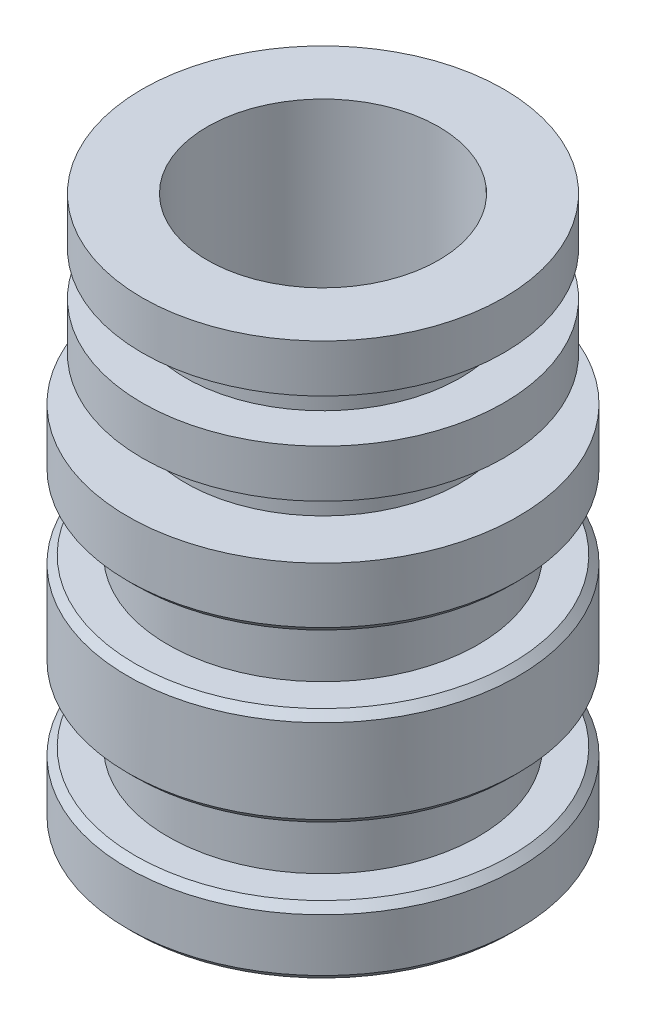
ISO-10303-21;
HEADER;
FILE_DESCRIPTION(('STEP AP214'),'2;1');
FILE_NAME('part.step','',(''),(''),'','','');
FILE_SCHEMA(('AUTOMOTIVE_DESIGN { 1 0 10303 214 1 1 1 1 }'));
ENDSEC;
DATA;
#1=APPLICATION_CONTEXT('core data for automotive mechanical design processes');
#2=APPLICATION_PROTOCOL_DEFINITION('international standard','automotive_design',2000,#1);
#3=PRODUCT_CONTEXT('',#1,'mechanical');
#4=PRODUCT('Part','Part','',(#3));
#5=PRODUCT_RELATED_PRODUCT_CATEGORY('part','',(#4));
#6=PRODUCT_DEFINITION_FORMATION('','',#4);
#7=PRODUCT_DEFINITION_CONTEXT('part definition',#1,'design');
#8=PRODUCT_DEFINITION('design','',#6,#7);
#9=PRODUCT_DEFINITION_SHAPE('','',#8);
#10=(LENGTH_UNIT() NAMED_UNIT(*) SI_UNIT(.MILLI.,.METRE.));
#11=(NAMED_UNIT(*) PLANE_ANGLE_UNIT() SI_UNIT($,.RADIAN.));
#12=(NAMED_UNIT(*) SI_UNIT($,.STERADIAN.) SOLID_ANGLE_UNIT());
#13=UNCERTAINTY_MEASURE_WITH_UNIT(LENGTH_MEASURE(1.E-05),#10,'distance_accuracy_value','');
#14=(GEOMETRIC_REPRESENTATION_CONTEXT(3) GLOBAL_UNCERTAINTY_ASSIGNED_CONTEXT((#13)) GLOBAL_UNIT_ASSIGNED_CONTEXT((#10,
#11,#12)) REPRESENTATION_CONTEXT('',''));
#15=CARTESIAN_POINT('',(0.,0.,0.));
#16=DIRECTION('',(0.,0.,1.));
#17=DIRECTION('',(1.,0.,0.));
#18=AXIS2_PLACEMENT_3D('',#15,#16,#17);
#19=CARTESIAN_POINT('',(-12.5,37.8,0.));
#20=DIRECTION('',(0.,-1.,0.));
#21=DIRECTION('',(0.,0.,-1.));
#22=AXIS2_PLACEMENT_3D('',#19,#20,#21);
#23=PLANE('',#22);
#24=CARTESIAN_POINT('',(0.,37.8,0.));
#25=DIRECTION('',(0.,-1.,0.));
#26=DIRECTION('',(0.,0.,-1.));
#27=AXIS2_PLACEMENT_3D('',#24,#25,#26);
#28=CIRCLE('',#27,12.5);
#29=CARTESIAN_POINT('',(0.,37.8,-12.5));
#30=VERTEX_POINT('',#29);
#31=EDGE_CURVE('E92',#30,#30,#28,.T.);
#32=ORIENTED_EDGE('',*,*,#31,.F.);
#33=EDGE_LOOP('',(#32));
#34=FACE_BOUND('',#33,.T.);
#35=CARTESIAN_POINT('',(0.,37.8,0.));
#36=DIRECTION('',(0.,-1.,0.));
#37=DIRECTION('',(0.,0.,-1.));
#38=AXIS2_PLACEMENT_3D('',#35,#36,#37);
#39=CIRCLE('',#38,8.);
#40=CARTESIAN_POINT('',(0.,37.8,-8.));
#41=VERTEX_POINT('',#40);
#42=EDGE_CURVE('E89',#41,#41,#39,.T.);
#43=ORIENTED_EDGE('',*,*,#42,.T.);
#44=EDGE_LOOP('',(#43));
#45=FACE_BOUND('',#44,.T.);
#46=ADVANCED_FACE('F38',(#34,#45),#23,.F.);
#47=CARTESIAN_POINT('',(0.,-29.1154086371947,0.));
#48=DIRECTION('',(0.,-1.,0.));
#49=DIRECTION('',(0.,0.,-1.));
#50=AXIS2_PLACEMENT_3D('',#47,#48,#49);
#51=CYLINDRICAL_SURFACE('',#50,12.5);
#52=CARTESIAN_POINT('',(0.,34.5,0.));
#53=DIRECTION('',(0.,-1.,0.));
#54=DIRECTION('',(0.,0.,-1.));
#55=AXIS2_PLACEMENT_3D('',#52,#53,#54);
#56=CIRCLE('',#55,12.5);
#57=CARTESIAN_POINT('',(0.,34.5,-12.5));
#58=VERTEX_POINT('',#57);
#59=EDGE_CURVE('E95',#58,#58,#56,.T.);
#60=ORIENTED_EDGE('',*,*,#59,.F.);
#61=EDGE_LOOP('',(#60));
#62=FACE_BOUND('',#61,.T.);
#63=ORIENTED_EDGE('',*,*,#31,.T.);
#64=EDGE_LOOP('',(#63));
#65=FACE_BOUND('',#64,.T.);
#66=ADVANCED_FACE('F152',(#62,#65),#51,.T.);
#67=CARTESIAN_POINT('',(-9.50000000000001,34.5,0.));
#68=DIRECTION('',(0.,1.,0.));
#69=DIRECTION('',(0.,0.,1.));
#70=AXIS2_PLACEMENT_3D('',#67,#68,#69);
#71=PLANE('',#70);
#72=CARTESIAN_POINT('',(0.,34.5,0.));
#73=DIRECTION('',(0.,-1.,0.));
#74=DIRECTION('',(0.,0.,-1.));
#75=AXIS2_PLACEMENT_3D('',#72,#73,#74);
#76=CIRCLE('',#75,9.50000000000001);
#77=CARTESIAN_POINT('',(0.,34.5,-9.50000000000001));
#78=VERTEX_POINT('',#77);
#79=EDGE_CURVE('E98',#78,#78,#76,.T.);
#80=ORIENTED_EDGE('',*,*,#79,.F.);
#81=EDGE_LOOP('',(#80));
#82=FACE_BOUND('',#81,.T.);
#83=ORIENTED_EDGE('',*,*,#59,.T.);
#84=EDGE_LOOP('',(#83));
#85=FACE_BOUND('',#84,.T.);
#86=ADVANCED_FACE('F158',(#82,#85),#71,.F.);
#87=CARTESIAN_POINT('',(0.,-29.1154086371947,0.));
#88=DIRECTION('',(0.,-1.,0.));
#89=DIRECTION('',(0.,0.,-1.));
#90=AXIS2_PLACEMENT_3D('',#87,#88,#89);
#91=CYLINDRICAL_SURFACE('',#90,9.50000000000001);
#92=CARTESIAN_POINT('',(0.,31.5,0.));
#93=DIRECTION('',(0.,-1.,0.));
#94=DIRECTION('',(0.,0.,-1.));
#95=AXIS2_PLACEMENT_3D('',#92,#93,#94);
#96=CIRCLE('',#95,9.50000000000001);
#97=CARTESIAN_POINT('',(0.,31.5,-9.50000000000001));
#98=VERTEX_POINT('',#97);
#99=EDGE_CURVE('E101',#98,#98,#96,.T.);
#100=ORIENTED_EDGE('',*,*,#99,.F.);
#101=EDGE_LOOP('',(#100));
#102=FACE_BOUND('',#101,.T.);
#103=ORIENTED_EDGE('',*,*,#79,.T.);
#104=EDGE_LOOP('',(#103));
#105=FACE_BOUND('',#104,.T.);
#106=ADVANCED_FACE('F270',(#102,#105),#91,.T.);
#107=CARTESIAN_POINT('',(-12.5,31.5,0.));
#108=DIRECTION('',(0.,-1.,0.));
#109=DIRECTION('',(0.,0.,-1.));
#110=AXIS2_PLACEMENT_3D('',#107,#108,#109);
#111=PLANE('',#110);
#112=CARTESIAN_POINT('',(0.,31.5,0.));
#113=DIRECTION('',(0.,-1.,0.));
#114=DIRECTION('',(0.,0.,-1.));
#115=AXIS2_PLACEMENT_3D('',#112,#113,#114);
#116=CIRCLE('',#115,12.5);
#117=CARTESIAN_POINT('',(0.,31.5,-12.5));
#118=VERTEX_POINT('',#117);
#119=EDGE_CURVE('E104',#118,#118,#116,.T.);
#120=ORIENTED_EDGE('',*,*,#119,.F.);
#121=EDGE_LOOP('',(#120));
#122=FACE_BOUND('',#121,.T.);
#123=ORIENTED_EDGE('',*,*,#99,.T.);
#124=EDGE_LOOP('',(#123));
#125=FACE_BOUND('',#124,.T.);
#126=ADVANCED_FACE('F266',(#122,#125),#111,.F.);
#127=CARTESIAN_POINT('',(0.,-29.1154086371947,0.));
#128=DIRECTION('',(0.,-1.,0.));
#129=DIRECTION('',(0.,0.,-1.));
#130=AXIS2_PLACEMENT_3D('',#127,#128,#129);
#131=CYLINDRICAL_SURFACE('',#130,12.5);
#132=CARTESIAN_POINT('',(0.,28.2,0.));
#133=DIRECTION('',(0.,-1.,0.));
#134=DIRECTION('',(0.,0.,-1.));
#135=AXIS2_PLACEMENT_3D('',#132,#133,#134);
#136=CIRCLE('',#135,12.5);
#137=CARTESIAN_POINT('',(0.,28.2,-12.5));
#138=VERTEX_POINT('',#137);
#139=EDGE_CURVE('E107',#138,#138,#136,.T.);
#140=ORIENTED_EDGE('',*,*,#139,.F.);
#141=EDGE_LOOP('',(#140));
#142=FACE_BOUND('',#141,.T.);
#143=ORIENTED_EDGE('',*,*,#119,.T.);
#144=EDGE_LOOP('',(#143));
#145=FACE_BOUND('',#144,.T.);
#146=ADVANCED_FACE('F262',(#142,#145),#131,.T.);
#147=CARTESIAN_POINT('',(-12.5,28.2,0.));
#148=DIRECTION('',(0.,1.,0.));
#149=DIRECTION('',(0.,0.,1.));
#150=AXIS2_PLACEMENT_3D('',#147,#148,#149);
#151=PLANE('',#150);
#152=CARTESIAN_POINT('',(0.,28.2,0.));
#153=DIRECTION('',(0.,-1.,0.));
#154=DIRECTION('',(0.,0.,-1.));
#155=AXIS2_PLACEMENT_3D('',#152,#153,#154);
#156=CIRCLE('',#155,9.50000000000001);
#157=CARTESIAN_POINT('',(0.,28.2,-9.50000000000001));
#158=VERTEX_POINT('',#157);
#159=EDGE_CURVE('E110',#158,#158,#156,.T.);
#160=ORIENTED_EDGE('',*,*,#159,.F.);
#161=EDGE_LOOP('',(#160));
#162=FACE_BOUND('',#161,.T.);
#163=ORIENTED_EDGE('',*,*,#139,.T.);
#164=EDGE_LOOP('',(#163));
#165=FACE_BOUND('',#164,.T.);
#166=ADVANCED_FACE('F258',(#162,#165),#151,.F.);
#167=CARTESIAN_POINT('',(0.,-29.1154086371947,0.));
#168=DIRECTION('',(0.,-1.,0.));
#169=DIRECTION('',(0.,0.,-1.));
#170=AXIS2_PLACEMENT_3D('',#167,#168,#169);
#171=CYLINDRICAL_SURFACE('',#170,9.50000000000001);
#172=CARTESIAN_POINT('',(0.,25.2,0.));
#173=DIRECTION('',(0.,-1.,0.));
#174=DIRECTION('',(0.,0.,-1.));
#175=AXIS2_PLACEMENT_3D('',#172,#173,#174);
#176=CIRCLE('',#175,9.50000000000001);
#177=CARTESIAN_POINT('',(0.,25.2,-9.50000000000001));
#178=VERTEX_POINT('',#177);
#179=EDGE_CURVE('E113',#178,#178,#176,.T.);
#180=ORIENTED_EDGE('',*,*,#179,.F.);
#181=EDGE_LOOP('',(#180));
#182=FACE_BOUND('',#181,.T.);
#183=ORIENTED_EDGE('',*,*,#159,.T.);
#184=EDGE_LOOP('',(#183));
#185=FACE_BOUND('',#184,.T.);
#186=ADVANCED_FACE('F254',(#182,#185),#171,.T.);
#187=CARTESIAN_POINT('',(-13.5,25.2,0.));
#188=DIRECTION('',(0.,-1.,0.));
#189=DIRECTION('',(0.,0.,-1.));
#190=AXIS2_PLACEMENT_3D('',#187,#188,#189);
#191=PLANE('',#190);
#192=CARTESIAN_POINT('',(0.,25.2,0.));
#193=DIRECTION('',(0.,-1.,0.));
#194=DIRECTION('',(0.,0.,-1.));
#195=AXIS2_PLACEMENT_3D('',#192,#193,#194);
#196=CIRCLE('',#195,13.5);
#197=CARTESIAN_POINT('',(0.,25.2,-13.5));
#198=VERTEX_POINT('',#197);
#199=EDGE_CURVE('E116',#198,#198,#196,.T.);
#200=ORIENTED_EDGE('',*,*,#199,.F.);
#201=EDGE_LOOP('',(#200));
#202=FACE_BOUND('',#201,.T.);
#203=ORIENTED_EDGE('',*,*,#179,.T.);
#204=EDGE_LOOP('',(#203));
#205=FACE_BOUND('',#204,.T.);
#206=ADVANCED_FACE('F250',(#202,#205),#191,.F.);
#207=CARTESIAN_POINT('',(0.,-29.1154086371947,0.));
#208=DIRECTION('',(0.,-1.,0.));
#209=DIRECTION('',(0.,0.,-1.));
#210=AXIS2_PLACEMENT_3D('',#207,#208,#209);
#211=CYLINDRICAL_SURFACE('',#210,13.5);
#212=CARTESIAN_POINT('',(0.,21.34,0.));
#213=DIRECTION('',(0.,1.,0.));
#214=DIRECTION('',(0.,0.,1.));
#215=AXIS2_PLACEMENT_3D('',#212,#213,#214);
#216=CIRCLE('',#215,13.5);
#217=CARTESIAN_POINT('',(0.,21.34,13.5));
#218=VERTEX_POINT('',#217);
#219=EDGE_CURVE('E71',#218,#218,#216,.T.);
#220=ORIENTED_EDGE('',*,*,#219,.T.);
#221=EDGE_LOOP('',(#220));
#222=FACE_BOUND('',#221,.T.);
#223=ORIENTED_EDGE('',*,*,#199,.T.);
#224=EDGE_LOOP('',(#223));
#225=FACE_BOUND('',#224,.T.);
#226=ADVANCED_FACE('F246',(#222,#225),#211,.T.);
#227=CARTESIAN_POINT('',(-13.5,20.84,0.));
#228=DIRECTION('',(0.,1.,0.));
#229=DIRECTION('',(0.,0.,1.));
#230=AXIS2_PLACEMENT_3D('',#227,#228,#229);
#231=PLANE('',#230);
#232=CARTESIAN_POINT('',(0.,20.84,0.));
#233=DIRECTION('',(0.,1.,0.));
#234=DIRECTION('',(0.,0.,1.));
#235=AXIS2_PLACEMENT_3D('',#232,#233,#234);
#236=CIRCLE('',#235,13.);
#237=CARTESIAN_POINT('',(0.,20.84,13.));
#238=VERTEX_POINT('',#237);
#239=EDGE_CURVE('E74',#238,#238,#236,.F.);
#240=ORIENTED_EDGE('',*,*,#239,.T.);
#241=EDGE_LOOP('',(#240));
#242=FACE_BOUND('',#241,.T.);
#243=CARTESIAN_POINT('',(0.,20.84,0.));
#244=DIRECTION('',(0.,-1.,0.));
#245=DIRECTION('',(0.,0.,-1.));
#246=AXIS2_PLACEMENT_3D('',#243,#244,#245);
#247=CIRCLE('',#246,10.73);
#248=CARTESIAN_POINT('',(0.,20.84,-10.73));
#249=VERTEX_POINT('',#248);
#250=EDGE_CURVE('E119',#249,#249,#247,.T.);
#251=ORIENTED_EDGE('',*,*,#250,.F.);
#252=EDGE_LOOP('',(#251));
#253=FACE_BOUND('',#252,.T.);
#254=ADVANCED_FACE('F242',(#242,#253),#231,.F.);
#255=CARTESIAN_POINT('',(0.,-29.1154086371947,0.));
#256=DIRECTION('',(0.,-1.,0.));
#257=DIRECTION('',(0.,0.,-1.));
#258=AXIS2_PLACEMENT_3D('',#255,#256,#257);
#259=CYLINDRICAL_SURFACE('',#258,10.73);
#260=CARTESIAN_POINT('',(0.,16.14,0.));
#261=DIRECTION('',(0.,-1.,0.));
#262=DIRECTION('',(0.,0.,-1.));
#263=AXIS2_PLACEMENT_3D('',#260,#261,#262);
#264=CIRCLE('',#263,10.73);
#265=CARTESIAN_POINT('',(0.,16.14,-10.73));
#266=VERTEX_POINT('',#265);
#267=EDGE_CURVE('E122',#266,#266,#264,.T.);
#268=ORIENTED_EDGE('',*,*,#267,.F.);
#269=EDGE_LOOP('',(#268));
#270=FACE_BOUND('',#269,.T.);
#271=ORIENTED_EDGE('',*,*,#250,.T.);
#272=EDGE_LOOP('',(#271));
#273=FACE_BOUND('',#272,.T.);
#274=ADVANCED_FACE('F238',(#270,#273),#259,.T.);
#275=CARTESIAN_POINT('',(-10.73,16.14,0.));
#276=DIRECTION('',(0.,-1.,0.));
#277=DIRECTION('',(0.,0.,-1.));
#278=AXIS2_PLACEMENT_3D('',#275,#276,#277);
#279=PLANE('',#278);
#280=CARTESIAN_POINT('',(0.,16.14,0.));
#281=DIRECTION('',(0.,-1.,0.));
#282=DIRECTION('',(0.,0.,-1.));
#283=AXIS2_PLACEMENT_3D('',#280,#281,#282);
#284=CIRCLE('',#283,13.);
#285=CARTESIAN_POINT('',(0.,16.14,-13.));
#286=VERTEX_POINT('',#285);
#287=EDGE_CURVE('E62',#286,#286,#284,.F.);
#288=ORIENTED_EDGE('',*,*,#287,.T.);
#289=EDGE_LOOP('',(#288));
#290=FACE_BOUND('',#289,.T.);
#291=ORIENTED_EDGE('',*,*,#267,.T.);
#292=EDGE_LOOP('',(#291));
#293=FACE_BOUND('',#292,.T.);
#294=ADVANCED_FACE('F234',(#290,#293),#279,.F.);
#295=CARTESIAN_POINT('',(0.,-29.1154086371947,0.));
#296=DIRECTION('',(0.,-1.,0.));
#297=DIRECTION('',(0.,0.,-1.));
#298=AXIS2_PLACEMENT_3D('',#295,#296,#297);
#299=CYLINDRICAL_SURFACE('',#298,13.5);
#300=CARTESIAN_POINT('',(0.,15.64,0.));
#301=DIRECTION('',(0.,-1.,0.));
#302=DIRECTION('',(0.,0.,-1.));
#303=AXIS2_PLACEMENT_3D('',#300,#301,#302);
#304=CIRCLE('',#303,13.5);
#305=CARTESIAN_POINT('',(0.,15.64,-13.5));
#306=VERTEX_POINT('',#305);
#307=EDGE_CURVE('E65',#306,#306,#304,.T.);
#308=ORIENTED_EDGE('',*,*,#307,.T.);
#309=EDGE_LOOP('',(#308));
#310=FACE_BOUND('',#309,.T.);
#311=CARTESIAN_POINT('',(0.,9.83999999999999,0.));
#312=DIRECTION('',(0.,1.,0.));
#313=DIRECTION('',(0.,0.,1.));
#314=AXIS2_PLACEMENT_3D('',#311,#312,#313);
#315=CIRCLE('',#314,13.5);
#316=CARTESIAN_POINT('',(0.,9.83999999999999,13.5));
#317=VERTEX_POINT('',#316);
#318=EDGE_CURVE('E68',#317,#317,#315,.T.);
#319=ORIENTED_EDGE('',*,*,#318,.T.);
#320=EDGE_LOOP('',(#319));
#321=FACE_BOUND('',#320,.T.);
#322=ADVANCED_FACE('F230',(#310,#321),#299,.T.);
#323=CARTESIAN_POINT('',(-13.5,9.34,0.));
#324=DIRECTION('',(0.,1.,0.));
#325=DIRECTION('',(0.,0.,1.));
#326=AXIS2_PLACEMENT_3D('',#323,#324,#325);
#327=PLANE('',#326);
#328=CARTESIAN_POINT('',(0.,9.34,0.));
#329=DIRECTION('',(0.,1.,0.));
#330=DIRECTION('',(0.,0.,1.));
#331=AXIS2_PLACEMENT_3D('',#328,#329,#330);
#332=CIRCLE('',#331,13.);
#333=CARTESIAN_POINT('',(0.,9.34,13.));
#334=VERTEX_POINT('',#333);
#335=EDGE_CURVE('E59',#334,#334,#332,.F.);
#336=ORIENTED_EDGE('',*,*,#335,.T.);
#337=EDGE_LOOP('',(#336));
#338=FACE_BOUND('',#337,.T.);
#339=CARTESIAN_POINT('',(0.,9.33999999999999,0.));
#340=DIRECTION('',(0.,-1.,0.));
#341=DIRECTION('',(0.,0.,-1.));
#342=AXIS2_PLACEMENT_3D('',#339,#340,#341);
#343=CIRCLE('',#342,10.73);
#344=CARTESIAN_POINT('',(0.,9.33999999999999,-10.73));
#345=VERTEX_POINT('',#344);
#346=EDGE_CURVE('E125',#345,#345,#343,.T.);
#347=ORIENTED_EDGE('',*,*,#346,.F.);
#348=EDGE_LOOP('',(#347));
#349=FACE_BOUND('',#348,.T.);
#350=ADVANCED_FACE('F226',(#338,#349),#327,.F.);
#351=CARTESIAN_POINT('',(0.,-29.1154086371947,0.));
#352=DIRECTION('',(0.,-1.,0.));
#353=DIRECTION('',(0.,0.,-1.));
#354=AXIS2_PLACEMENT_3D('',#351,#352,#353);
#355=CYLINDRICAL_SURFACE('',#354,10.73);
#356=CARTESIAN_POINT('',(0.,4.64,0.));
#357=DIRECTION('',(0.,-1.,0.));
#358=DIRECTION('',(0.,0.,-1.));
#359=AXIS2_PLACEMENT_3D('',#356,#357,#358);
#360=CIRCLE('',#359,10.73);
#361=CARTESIAN_POINT('',(0.,4.64,-10.73));
#362=VERTEX_POINT('',#361);
#363=EDGE_CURVE('E128',#362,#362,#360,.T.);
#364=ORIENTED_EDGE('',*,*,#363,.F.);
#365=EDGE_LOOP('',(#364));
#366=FACE_BOUND('',#365,.T.);
#367=ORIENTED_EDGE('',*,*,#346,.T.);
#368=EDGE_LOOP('',(#367));
#369=FACE_BOUND('',#368,.T.);
#370=ADVANCED_FACE('F221',(#366,#369),#355,.T.);
#371=CARTESIAN_POINT('',(-10.73,4.64,0.));
#372=DIRECTION('',(0.,-1.,0.));
#373=DIRECTION('',(0.,0.,-1.));
#374=AXIS2_PLACEMENT_3D('',#371,#372,#373);
#375=PLANE('',#374);
#376=CARTESIAN_POINT('',(0.,4.64,0.));
#377=DIRECTION('',(0.,-1.,0.));
#378=DIRECTION('',(0.,0.,-1.));
#379=AXIS2_PLACEMENT_3D('',#376,#377,#378);
#380=CIRCLE('',#379,13.);
#381=CARTESIAN_POINT('',(0.,4.64,-13.));
#382=VERTEX_POINT('',#381);
#383=EDGE_CURVE('E46',#382,#382,#380,.F.);
#384=ORIENTED_EDGE('',*,*,#383,.T.);
#385=EDGE_LOOP('',(#384));
#386=FACE_BOUND('',#385,.T.);
#387=ORIENTED_EDGE('',*,*,#363,.T.);
#388=EDGE_LOOP('',(#387));
#389=FACE_BOUND('',#388,.T.);
#390=ADVANCED_FACE('F214',(#386,#389),#375,.F.);
#391=CARTESIAN_POINT('',(0.,-29.1154086371947,0.));
#392=DIRECTION('',(0.,-1.,0.));
#393=DIRECTION('',(0.,0.,-1.));
#394=AXIS2_PLACEMENT_3D('',#391,#392,#393);
#395=CYLINDRICAL_SURFACE('',#394,13.5);
#396=CARTESIAN_POINT('',(0.,4.14,0.));
#397=DIRECTION('',(0.,-1.,0.));
#398=DIRECTION('',(0.,0.,-1.));
#399=AXIS2_PLACEMENT_3D('',#396,#397,#398);
#400=CIRCLE('',#399,13.5);
#401=CARTESIAN_POINT('',(0.,4.14,-13.5));
#402=VERTEX_POINT('',#401);
#403=EDGE_CURVE('E50',#402,#402,#400,.T.);
#404=ORIENTED_EDGE('',*,*,#403,.T.);
#405=EDGE_LOOP('',(#404));
#406=FACE_BOUND('',#405,.T.);
#407=CARTESIAN_POINT('',(0.,0.500000000000007,0.));
#408=DIRECTION('',(0.,1.,0.));
#409=DIRECTION('',(0.,0.,1.));
#410=AXIS2_PLACEMENT_3D('',#407,#408,#409);
#411=CIRCLE('',#410,13.5);
#412=CARTESIAN_POINT('',(0.,0.500000000000007,13.5));
#413=VERTEX_POINT('',#412);
#414=EDGE_CURVE('E54',#413,#413,#411,.T.);
#415=ORIENTED_EDGE('',*,*,#414,.T.);
#416=EDGE_LOOP('',(#415));
#417=FACE_BOUND('',#416,.T.);
#418=ADVANCED_FACE('F149',(#406,#417),#395,.T.);
#419=CARTESIAN_POINT('',(0.,0.,0.));
#420=DIRECTION('',(0.,1.,0.));
#421=DIRECTION('',(0.,0.,1.));
#422=AXIS2_PLACEMENT_3D('',#419,#420,#421);
#423=PLANE('',#422);
#424=CARTESIAN_POINT('',(0.,0.,0.));
#425=DIRECTION('',(0.,1.,0.));
#426=DIRECTION('',(0.,0.,1.));
#427=AXIS2_PLACEMENT_3D('',#424,#425,#426);
#428=CIRCLE('',#427,13.);
#429=CARTESIAN_POINT('',(0.,0.,13.));
#430=VERTEX_POINT('',#429);
#431=EDGE_CURVE('E10',#430,#430,#428,.F.);
#432=ORIENTED_EDGE('',*,*,#431,.T.);
#433=EDGE_LOOP('',(#432));
#434=FACE_BOUND('',#433,.T.);
#435=CARTESIAN_POINT('',(0.,0.,0.));
#436=DIRECTION('',(0.,1.,0.));
#437=DIRECTION('',(0.,0.,1.));
#438=AXIS2_PLACEMENT_3D('',#435,#436,#437);
#439=CIRCLE('',#438,4.00000000000002);
#440=CARTESIAN_POINT('',(0.,0.,4.00000000000002));
#441=VERTEX_POINT('',#440);
#442=EDGE_CURVE('E77',#441,#441,#439,.T.);
#443=ORIENTED_EDGE('',*,*,#442,.T.);
#444=EDGE_LOOP('',(#443));
#445=FACE_BOUND('',#444,.T.);
#446=ADVANCED_FACE('F139',(#434,#445),#423,.F.);
#447=CARTESIAN_POINT('',(-8.,8.,0.));
#448=DIRECTION('',(0.,-1.,0.));
#449=DIRECTION('',(0.,0.,-1.));
#450=AXIS2_PLACEMENT_3D('',#447,#448,#449);
#451=PLANE('',#450);
#452=CARTESIAN_POINT('',(0.,8.,0.));
#453=DIRECTION('',(0.,-1.,0.));
#454=DIRECTION('',(0.,0.,-1.));
#455=AXIS2_PLACEMENT_3D('',#452,#453,#454);
#456=CIRCLE('',#455,3.99999999999999);
#457=CARTESIAN_POINT('',(0.,8.,-3.99999999999999));
#458=VERTEX_POINT('',#457);
#459=EDGE_CURVE('E86',#458,#458,#456,.T.);
#460=ORIENTED_EDGE('',*,*,#459,.T.);
#461=EDGE_LOOP('',(#460));
#462=FACE_BOUND('',#461,.T.);
#463=CARTESIAN_POINT('',(0.,8.,0.));
#464=DIRECTION('',(0.,-1.,0.));
#465=DIRECTION('',(0.,0.,-1.));
#466=AXIS2_PLACEMENT_3D('',#463,#464,#465);
#467=CIRCLE('',#466,8.);
#468=CARTESIAN_POINT('',(0.,8.,-8.));
#469=VERTEX_POINT('',#468);
#470=EDGE_CURVE('E131',#469,#469,#467,.T.);
#471=ORIENTED_EDGE('',*,*,#470,.F.);
#472=EDGE_LOOP('',(#471));
#473=FACE_BOUND('',#472,.T.);
#474=ADVANCED_FACE('F137',(#462,#473),#451,.F.);
#475=CARTESIAN_POINT('',(0.,-29.1154086371947,0.));
#476=DIRECTION('',(0.,-1.,0.));
#477=DIRECTION('',(0.,0.,-1.));
#478=AXIS2_PLACEMENT_3D('',#475,#476,#477);
#479=CYLINDRICAL_SURFACE('',#478,8.);
#480=ORIENTED_EDGE('',*,*,#42,.F.);
#481=EDGE_LOOP('',(#480));
#482=FACE_BOUND('',#481,.T.);
#483=ORIENTED_EDGE('',*,*,#470,.T.);
#484=EDGE_LOOP('',(#483));
#485=FACE_BOUND('',#484,.T.);
#486=ADVANCED_FACE('F135',(#482,#485),#479,.F.);
#487=CARTESIAN_POINT('',(0.,37.8,0.));
#488=DIRECTION('',(0.,-1.,0.));
#489=DIRECTION('',(0.,0.,-1.));
#490=AXIS2_PLACEMENT_3D('',#487,#488,#489);
#491=CYLINDRICAL_SURFACE('',#490,3.);
#492=CARTESIAN_POINT('',(0.,7.,0.));
#493=DIRECTION('',(0.,-1.,0.));
#494=DIRECTION('',(0.,0.,-1.));
#495=AXIS2_PLACEMENT_3D('',#492,#493,#494);
#496=CIRCLE('',#495,3.);
#497=CARTESIAN_POINT('',(0.,7.,-3.));
#498=VERTEX_POINT('',#497);
#499=EDGE_CURVE('E80',#498,#498,#496,.F.);
#500=ORIENTED_EDGE('',*,*,#499,.T.);
#501=EDGE_LOOP('',(#500));
#502=FACE_BOUND('',#501,.T.);
#503=CARTESIAN_POINT('',(0.,1.00000000000001,0.));
#504=DIRECTION('',(0.,1.,0.));
#505=DIRECTION('',(0.,0.,1.));
#506=AXIS2_PLACEMENT_3D('',#503,#504,#505);
#507=CIRCLE('',#506,3.);
#508=CARTESIAN_POINT('',(0.,1.00000000000001,3.));
#509=VERTEX_POINT('',#508);
#510=EDGE_CURVE('E83',#509,#509,#507,.F.);
#511=ORIENTED_EDGE('',*,*,#510,.T.);
#512=EDGE_LOOP('',(#511));
#513=FACE_BOUND('',#512,.T.);
#514=ADVANCED_FACE('F146',(#502,#513),#491,.F.);
#515=CARTESIAN_POINT('',(0.,8.,0.));
#516=DIRECTION('',(0.,1.,0.));
#517=DIRECTION('',(0.,0.,1.));
#518=AXIS2_PLACEMENT_3D('',#515,#516,#517);
#519=CONICAL_SURFACE('',#518,4.,0.785398163397446);
#520=ORIENTED_EDGE('',*,*,#499,.F.);
#521=EDGE_LOOP('',(#520));
#522=FACE_BOUND('',#521,.T.);
#523=ORIENTED_EDGE('',*,*,#459,.F.);
#524=EDGE_LOOP('',(#523));
#525=FACE_BOUND('',#524,.T.);
#526=ADVANCED_FACE('F166',(#522,#525),#519,.F.);
#527=CARTESIAN_POINT('',(0.,1.00000000000001,0.));
#528=DIRECTION('',(0.,-1.,0.));
#529=DIRECTION('',(0.,0.,-1.));
#530=AXIS2_PLACEMENT_3D('',#527,#528,#529);
#531=CONICAL_SURFACE('',#530,3.,0.785398163397449);
#532=ORIENTED_EDGE('',*,*,#442,.F.);
#533=EDGE_LOOP('',(#532));
#534=FACE_BOUND('',#533,.T.);
#535=ORIENTED_EDGE('',*,*,#510,.F.);
#536=EDGE_LOOP('',(#535));
#537=FACE_BOUND('',#536,.T.);
#538=ADVANCED_FACE('F172',(#534,#537),#531,.F.);
#539=CARTESIAN_POINT('',(0.,20.84,0.));
#540=DIRECTION('',(0.,1.,0.));
#541=DIRECTION('',(0.,0.,1.));
#542=AXIS2_PLACEMENT_3D('',#539,#540,#541);
#543=CONICAL_SURFACE('',#542,13.,0.785398163397441);
#544=ORIENTED_EDGE('',*,*,#219,.F.);
#545=EDGE_LOOP('',(#544));
#546=FACE_BOUND('',#545,.T.);
#547=ORIENTED_EDGE('',*,*,#239,.F.);
#548=EDGE_LOOP('',(#547));
#549=FACE_BOUND('',#548,.T.);
#550=ADVANCED_FACE('F179',(#546,#549),#543,.T.);
#551=CARTESIAN_POINT('',(0.,15.64,0.));
#552=DIRECTION('',(0.,-1.,0.));
#553=DIRECTION('',(0.,0.,-1.));
#554=AXIS2_PLACEMENT_3D('',#551,#552,#553);
#555=CONICAL_SURFACE('',#554,13.5,0.785398163397452);
#556=ORIENTED_EDGE('',*,*,#287,.F.);
#557=EDGE_LOOP('',(#556));
#558=FACE_BOUND('',#557,.T.);
#559=ORIENTED_EDGE('',*,*,#307,.F.);
#560=EDGE_LOOP('',(#559));
#561=FACE_BOUND('',#560,.T.);
#562=ADVANCED_FACE('F186',(#558,#561),#555,.T.);
#563=CARTESIAN_POINT('',(0.,9.33999999999999,0.));
#564=DIRECTION('',(0.,1.,0.));
#565=DIRECTION('',(0.,0.,1.));
#566=AXIS2_PLACEMENT_3D('',#563,#564,#565);
#567=CONICAL_SURFACE('',#566,13.,0.785398163397445);
#568=ORIENTED_EDGE('',*,*,#318,.F.);
#569=EDGE_LOOP('',(#568));
#570=FACE_BOUND('',#569,.T.);
#571=ORIENTED_EDGE('',*,*,#335,.F.);
#572=EDGE_LOOP('',(#571));
#573=FACE_BOUND('',#572,.T.);
#574=ADVANCED_FACE('F193',(#570,#573),#567,.T.);
#575=CARTESIAN_POINT('',(0.,4.14,0.));
#576=DIRECTION('',(0.,-1.,0.));
#577=DIRECTION('',(0.,0.,-1.));
#578=AXIS2_PLACEMENT_3D('',#575,#576,#577);
#579=CONICAL_SURFACE('',#578,13.5,0.785398163397448);
#580=ORIENTED_EDGE('',*,*,#383,.F.);
#581=EDGE_LOOP('',(#580));
#582=FACE_BOUND('',#581,.T.);
#583=ORIENTED_EDGE('',*,*,#403,.F.);
#584=EDGE_LOOP('',(#583));
#585=FACE_BOUND('',#584,.T.);
#586=ADVANCED_FACE('F199',(#582,#585),#579,.T.);
#587=CARTESIAN_POINT('',(0.,0.,0.));
#588=DIRECTION('',(0.,1.,0.));
#589=DIRECTION('',(0.,0.,1.));
#590=AXIS2_PLACEMENT_3D('',#587,#588,#589);
#591=CONICAL_SURFACE('',#590,13.,0.785398163397445);
#592=ORIENTED_EDGE('',*,*,#414,.F.);
#593=EDGE_LOOP('',(#592));
#594=FACE_BOUND('',#593,.T.);
#595=ORIENTED_EDGE('',*,*,#431,.F.);
#596=EDGE_LOOP('',(#595));
#597=FACE_BOUND('',#596,.T.);
#598=ADVANCED_FACE('F41',(#594,#597),#591,.T.);
#599=CLOSED_SHELL('',(#46,#66,#86,#106,#126,#146,#166,#186,#206,#226,#254,#274,#294,#322,#350,
#370,#390,#418,#446,#474,#486,#514,#526,#538,#550,#562,#574,#586,#598));
#600=MANIFOLD_SOLID_BREP('B2',#599);
#601=ADVANCED_BREP_SHAPE_REPRESENTATION('',(#18,#600),#14);
#602=SHAPE_DEFINITION_REPRESENTATION(#9,#601);
ENDSEC;
END-ISO-10303-21;
